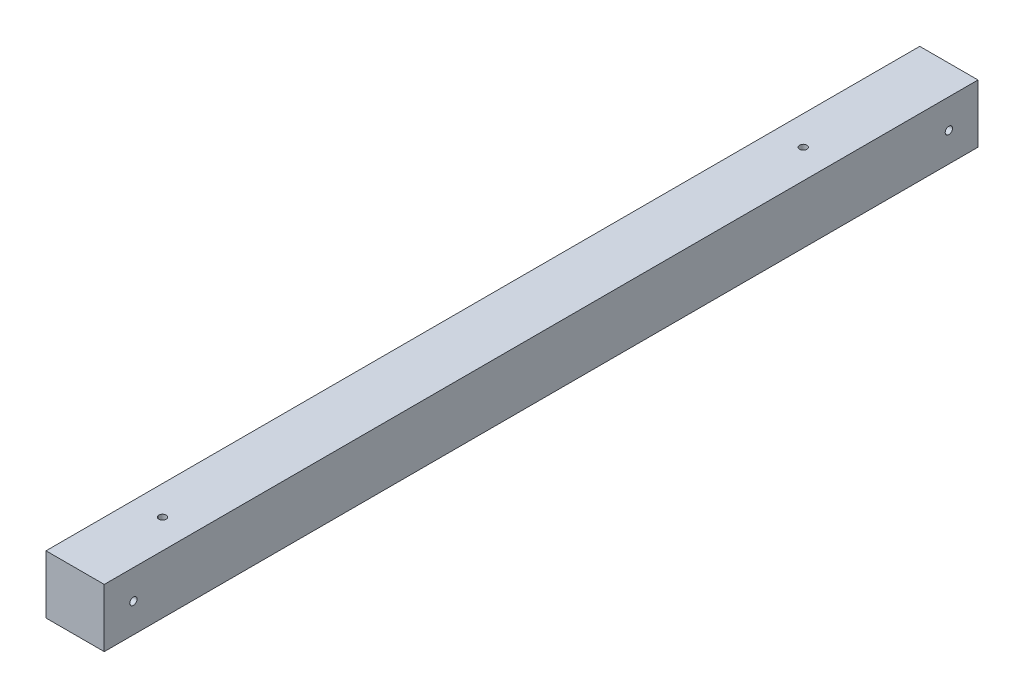
ISO-10303-21;
HEADER;
FILE_DESCRIPTION(('STEP AP214'),'2;1');
FILE_NAME('part.step','',(''),(''),'','','');
FILE_SCHEMA(('AUTOMOTIVE_DESIGN { 1 0 10303 214 1 1 1 1 }'));
ENDSEC;
DATA;
#1=APPLICATION_CONTEXT('core data for automotive mechanical design processes');
#2=APPLICATION_PROTOCOL_DEFINITION('international standard','automotive_design',2000,#1);
#3=PRODUCT_CONTEXT('',#1,'mechanical');
#4=PRODUCT('Part','Part','',(#3));
#5=PRODUCT_RELATED_PRODUCT_CATEGORY('part','',(#4));
#6=PRODUCT_DEFINITION_FORMATION('','',#4);
#7=PRODUCT_DEFINITION_CONTEXT('part definition',#1,'design');
#8=PRODUCT_DEFINITION('design','',#6,#7);
#9=PRODUCT_DEFINITION_SHAPE('','',#8);
#10=(LENGTH_UNIT() NAMED_UNIT(*) SI_UNIT(.MILLI.,.METRE.));
#11=(NAMED_UNIT(*) PLANE_ANGLE_UNIT() SI_UNIT($,.RADIAN.));
#12=(NAMED_UNIT(*) SI_UNIT($,.STERADIAN.) SOLID_ANGLE_UNIT());
#13=UNCERTAINTY_MEASURE_WITH_UNIT(LENGTH_MEASURE(1.E-05),#10,'distance_accuracy_value','');
#14=(GEOMETRIC_REPRESENTATION_CONTEXT(3) GLOBAL_UNCERTAINTY_ASSIGNED_CONTEXT((#13)) GLOBAL_UNIT_ASSIGNED_CONTEXT((#10,
#11,#12)) REPRESENTATION_CONTEXT('',''));
#15=CARTESIAN_POINT('',(0.,0.,0.));
#16=DIRECTION('',(0.,0.,1.));
#17=DIRECTION('',(1.,0.,0.));
#18=AXIS2_PLACEMENT_3D('',#15,#16,#17);
#19=CARTESIAN_POINT('',(-12.7,-12.7,381.));
#20=DIRECTION('',(1.,0.,0.));
#21=DIRECTION('',(0.,0.,-1.));
#22=AXIS2_PLACEMENT_3D('',#19,#20,#21);
#23=PLANE('',#22);
#24=CARTESIAN_POINT('',(-12.7,0.,368.3));
#25=DIRECTION('',(1.,0.,0.));
#26=DIRECTION('',(0.,0.,-1.));
#27=AXIS2_PLACEMENT_3D('',#24,#25,#26);
#28=CIRCLE('',#27,1.5875);
#29=CARTESIAN_POINT('',(-12.7,0.,366.7125));
#30=VERTEX_POINT('',#29);
#31=EDGE_CURVE('E134',#30,#30,#28,.T.);
#32=ORIENTED_EDGE('',*,*,#31,.T.);
#33=EDGE_LOOP('',(#32));
#34=FACE_BOUND('',#33,.T.);
#35=CARTESIAN_POINT('',(-12.7,0.,12.7));
#36=DIRECTION('',(1.,0.,0.));
#37=DIRECTION('',(0.,0.,-1.));
#38=AXIS2_PLACEMENT_3D('',#35,#36,#37);
#39=CIRCLE('',#38,1.5875);
#40=CARTESIAN_POINT('',(-12.7,0.,11.1125));
#41=VERTEX_POINT('',#40);
#42=EDGE_CURVE('E110',#41,#41,#39,.T.);
#43=ORIENTED_EDGE('',*,*,#42,.T.);
#44=EDGE_LOOP('',(#43));
#45=FACE_BOUND('',#44,.T.);
#46=DIRECTION('',(0.,-1.,0.));
#47=VECTOR('',#46,1.);
#48=CARTESIAN_POINT('',(-12.7,-12.7,0.));
#49=LINE('',#48,#47);
#50=CARTESIAN_POINT('',(-12.7,12.7,0.));
#51=VERTEX_POINT('',#50);
#52=CARTESIAN_POINT('',(-12.7,-12.7,0.));
#53=VERTEX_POINT('',#52);
#54=EDGE_CURVE('E106',#51,#53,#49,.T.);
#55=ORIENTED_EDGE('',*,*,#54,.T.);
#56=DIRECTION('',(0.,0.,-1.));
#57=VECTOR('',#56,1.);
#58=CARTESIAN_POINT('',(-12.7,-12.7,381.));
#59=LINE('',#58,#57);
#60=CARTESIAN_POINT('',(-12.7,-12.7,381.));
#61=VERTEX_POINT('',#60);
#62=EDGE_CURVE('E11',#61,#53,#59,.T.);
#63=ORIENTED_EDGE('',*,*,#62,.F.);
#64=DIRECTION('',(0.,-1.,0.));
#65=VECTOR('',#64,1.);
#66=CARTESIAN_POINT('',(-12.7,-12.7,381.));
#67=LINE('',#66,#65);
#68=CARTESIAN_POINT('',(-12.7,12.7,381.));
#69=VERTEX_POINT('',#68);
#70=EDGE_CURVE('E90',#69,#61,#67,.T.);
#71=ORIENTED_EDGE('',*,*,#70,.F.);
#72=DIRECTION('',(0.,0.,-1.));
#73=VECTOR('',#72,1.);
#74=CARTESIAN_POINT('',(-12.7,12.7,381.));
#75=LINE('',#74,#73);
#76=EDGE_CURVE('E102',#69,#51,#75,.T.);
#77=ORIENTED_EDGE('',*,*,#76,.T.);
#78=EDGE_LOOP('',(#55,#63,#71,#77));
#79=FACE_BOUND('',#78,.T.);
#80=ADVANCED_FACE('F38',(#34,#45,#79),#23,.F.);
#81=CARTESIAN_POINT('',(12.7,-12.7,381.));
#82=DIRECTION('',(0.,1.,0.));
#83=DIRECTION('',(-1.,0.,0.));
#84=AXIS2_PLACEMENT_3D('',#81,#82,#83);
#85=PLANE('',#84);
#86=CARTESIAN_POINT('',(0.,-12.7,342.9));
#87=DIRECTION('',(0.,1.,0.));
#88=DIRECTION('',(0.,0.,1.));
#89=AXIS2_PLACEMENT_3D('',#86,#87,#88);
#90=CIRCLE('',#89,1.5875);
#91=CARTESIAN_POINT('',(0.,-12.7,344.4875));
#92=VERTEX_POINT('',#91);
#93=EDGE_CURVE('E150',#92,#92,#90,.T.);
#94=ORIENTED_EDGE('',*,*,#93,.T.);
#95=EDGE_LOOP('',(#94));
#96=FACE_BOUND('',#95,.T.);
#97=CARTESIAN_POINT('',(0.,-12.7,63.5));
#98=DIRECTION('',(0.,1.,0.));
#99=DIRECTION('',(0.,0.,1.));
#100=AXIS2_PLACEMENT_3D('',#97,#98,#99);
#101=CIRCLE('',#100,1.5875);
#102=CARTESIAN_POINT('',(0.,-12.7,65.0875));
#103=VERTEX_POINT('',#102);
#104=EDGE_CURVE('E142',#103,#103,#101,.T.);
#105=ORIENTED_EDGE('',*,*,#104,.T.);
#106=EDGE_LOOP('',(#105));
#107=FACE_BOUND('',#106,.T.);
#108=DIRECTION('',(1.,0.,0.));
#109=VECTOR('',#108,1.);
#110=CARTESIAN_POINT('',(12.7,-12.7,0.));
#111=LINE('',#110,#109);
#112=CARTESIAN_POINT('',(12.7,-12.7,0.));
#113=VERTEX_POINT('',#112);
#114=EDGE_CURVE('E95',#53,#113,#111,.T.);
#115=ORIENTED_EDGE('',*,*,#114,.T.);
#116=DIRECTION('',(0.,0.,-1.));
#117=VECTOR('',#116,1.);
#118=CARTESIAN_POINT('',(12.7,-12.7,381.));
#119=LINE('',#118,#117);
#120=CARTESIAN_POINT('',(12.7,-12.7,381.));
#121=VERTEX_POINT('',#120);
#122=EDGE_CURVE('E47',#121,#113,#119,.T.);
#123=ORIENTED_EDGE('',*,*,#122,.F.);
#124=DIRECTION('',(1.,0.,0.));
#125=VECTOR('',#124,1.);
#126=CARTESIAN_POINT('',(12.7,-12.7,381.));
#127=LINE('',#126,#125);
#128=EDGE_CURVE('E85',#61,#121,#127,.T.);
#129=ORIENTED_EDGE('',*,*,#128,.F.);
#130=ORIENTED_EDGE('',*,*,#62,.T.);
#131=EDGE_LOOP('',(#115,#123,#129,#130));
#132=FACE_BOUND('',#131,.T.);
#133=ADVANCED_FACE('F94',(#96,#107,#132),#85,.F.);
#134=CARTESIAN_POINT('',(12.7,-12.7,381.));
#135=DIRECTION('',(-1.,0.,0.));
#136=DIRECTION('',(0.,0.,1.));
#137=AXIS2_PLACEMENT_3D('',#134,#135,#136);
#138=PLANE('',#137);
#139=CARTESIAN_POINT('',(12.7,0.,368.3));
#140=DIRECTION('',(1.,0.,0.));
#141=DIRECTION('',(0.,0.,-1.));
#142=AXIS2_PLACEMENT_3D('',#139,#140,#141);
#143=CIRCLE('',#142,1.58749999999999);
#144=CARTESIAN_POINT('',(12.7,0.,366.7125));
#145=VERTEX_POINT('',#144);
#146=EDGE_CURVE('E138',#145,#145,#143,.T.);
#147=ORIENTED_EDGE('',*,*,#146,.F.);
#148=EDGE_LOOP('',(#147));
#149=FACE_BOUND('',#148,.T.);
#150=CARTESIAN_POINT('',(12.7,0.,12.7));
#151=DIRECTION('',(1.,0.,0.));
#152=DIRECTION('',(0.,0.,-1.));
#153=AXIS2_PLACEMENT_3D('',#150,#151,#152);
#154=CIRCLE('',#153,1.58749999999999);
#155=CARTESIAN_POINT('',(12.7,0.,11.1125));
#156=VERTEX_POINT('',#155);
#157=EDGE_CURVE('E130',#156,#156,#154,.T.);
#158=ORIENTED_EDGE('',*,*,#157,.F.);
#159=EDGE_LOOP('',(#158));
#160=FACE_BOUND('',#159,.T.);
#161=DIRECTION('',(0.,1.,0.));
#162=VECTOR('',#161,1.);
#163=CARTESIAN_POINT('',(12.7,-12.7,0.));
#164=LINE('',#163,#162);
#165=CARTESIAN_POINT('',(12.7,12.7,0.));
#166=VERTEX_POINT('',#165);
#167=EDGE_CURVE('E72',#113,#166,#164,.T.);
#168=ORIENTED_EDGE('',*,*,#167,.T.);
#169=DIRECTION('',(0.,0.,-1.));
#170=VECTOR('',#169,1.);
#171=CARTESIAN_POINT('',(12.7,12.7,381.));
#172=LINE('',#171,#170);
#173=CARTESIAN_POINT('',(12.7,12.7,381.));
#174=VERTEX_POINT('',#173);
#175=EDGE_CURVE('E97',#174,#166,#172,.T.);
#176=ORIENTED_EDGE('',*,*,#175,.F.);
#177=DIRECTION('',(0.,1.,0.));
#178=VECTOR('',#177,1.);
#179=CARTESIAN_POINT('',(12.7,-12.7,381.));
#180=LINE('',#179,#178);
#181=EDGE_CURVE('E88',#121,#174,#180,.T.);
#182=ORIENTED_EDGE('',*,*,#181,.F.);
#183=ORIENTED_EDGE('',*,*,#122,.T.);
#184=EDGE_LOOP('',(#168,#176,#182,#183));
#185=FACE_BOUND('',#184,.T.);
#186=ADVANCED_FACE('F98',(#149,#160,#185),#138,.F.);
#187=CARTESIAN_POINT('',(12.7,12.7,381.));
#188=DIRECTION('',(0.,-1.,0.));
#189=DIRECTION('',(1.,0.,0.));
#190=AXIS2_PLACEMENT_3D('',#187,#188,#189);
#191=PLANE('',#190);
#192=CARTESIAN_POINT('',(0.,12.7,342.9));
#193=DIRECTION('',(0.,1.,0.));
#194=DIRECTION('',(0.,0.,1.));
#195=AXIS2_PLACEMENT_3D('',#192,#193,#194);
#196=CIRCLE('',#195,1.58749999999999);
#197=CARTESIAN_POINT('',(0.,12.7,344.4875));
#198=VERTEX_POINT('',#197);
#199=EDGE_CURVE('E154',#198,#198,#196,.T.);
#200=ORIENTED_EDGE('',*,*,#199,.F.);
#201=EDGE_LOOP('',(#200));
#202=FACE_BOUND('',#201,.T.);
#203=CARTESIAN_POINT('',(0.,12.7,63.5));
#204=DIRECTION('',(0.,1.,0.));
#205=DIRECTION('',(0.,0.,1.));
#206=AXIS2_PLACEMENT_3D('',#203,#204,#205);
#207=CIRCLE('',#206,1.58749999999999);
#208=CARTESIAN_POINT('',(0.,12.7,65.0875));
#209=VERTEX_POINT('',#208);
#210=EDGE_CURVE('E146',#209,#209,#207,.T.);
#211=ORIENTED_EDGE('',*,*,#210,.F.);
#212=EDGE_LOOP('',(#211));
#213=FACE_BOUND('',#212,.T.);
#214=DIRECTION('',(-1.,0.,0.));
#215=VECTOR('',#214,1.);
#216=CARTESIAN_POINT('',(12.7,12.7,0.));
#217=LINE('',#216,#215);
#218=EDGE_CURVE('E78',#166,#51,#217,.T.);
#219=ORIENTED_EDGE('',*,*,#218,.T.);
#220=ORIENTED_EDGE('',*,*,#76,.F.);
#221=DIRECTION('',(-1.,0.,0.));
#222=VECTOR('',#221,1.);
#223=CARTESIAN_POINT('',(12.7,12.7,381.));
#224=LINE('',#223,#222);
#225=EDGE_CURVE('E55',#174,#69,#224,.T.);
#226=ORIENTED_EDGE('',*,*,#225,.F.);
#227=ORIENTED_EDGE('',*,*,#175,.T.);
#228=EDGE_LOOP('',(#219,#220,#226,#227));
#229=FACE_BOUND('',#228,.T.);
#230=ADVANCED_FACE('F120',(#202,#213,#229),#191,.F.);
#231=CARTESIAN_POINT('',(0.,0.,381.));
#232=DIRECTION('',(0.,0.,1.));
#233=DIRECTION('',(1.,0.,0.));
#234=AXIS2_PLACEMENT_3D('',#231,#232,#233);
#235=PLANE('',#234);
#236=ORIENTED_EDGE('',*,*,#70,.T.);
#237=ORIENTED_EDGE('',*,*,#128,.T.);
#238=ORIENTED_EDGE('',*,*,#181,.T.);
#239=ORIENTED_EDGE('',*,*,#225,.T.);
#240=EDGE_LOOP('',(#236,#237,#238,#239));
#241=FACE_BOUND('',#240,.T.);
#242=ADVANCED_FACE('F86',(#241),#235,.T.);
#243=CARTESIAN_POINT('',(0.,0.,0.));
#244=DIRECTION('',(0.,0.,1.));
#245=DIRECTION('',(1.,0.,0.));
#246=AXIS2_PLACEMENT_3D('',#243,#244,#245);
#247=PLANE('',#246);
#248=ORIENTED_EDGE('',*,*,#54,.F.);
#249=ORIENTED_EDGE('',*,*,#218,.F.);
#250=ORIENTED_EDGE('',*,*,#167,.F.);
#251=ORIENTED_EDGE('',*,*,#114,.F.);
#252=EDGE_LOOP('',(#248,#249,#250,#251));
#253=FACE_BOUND('',#252,.T.);
#254=ADVANCED_FACE('F123',(#253),#247,.F.);
#255=CARTESIAN_POINT('',(12.7,0.,12.7));
#256=DIRECTION('',(1.,0.,0.));
#257=DIRECTION('',(0.,0.,-1.));
#258=AXIS2_PLACEMENT_3D('',#255,#256,#257);
#259=CYLINDRICAL_SURFACE('',#258,1.58749999999999);
#260=ORIENTED_EDGE('',*,*,#42,.F.);
#261=EDGE_LOOP('',(#260));
#262=FACE_BOUND('',#261,.T.);
#263=ORIENTED_EDGE('',*,*,#157,.T.);
#264=EDGE_LOOP('',(#263));
#265=FACE_BOUND('',#264,.T.);
#266=ADVANCED_FACE('F177',(#262,#265),#259,.F.);
#267=CARTESIAN_POINT('',(12.7,0.,368.3));
#268=DIRECTION('',(1.,0.,0.));
#269=DIRECTION('',(0.,0.,-1.));
#270=AXIS2_PLACEMENT_3D('',#267,#268,#269);
#271=CYLINDRICAL_SURFACE('',#270,1.58749999999999);
#272=ORIENTED_EDGE('',*,*,#31,.F.);
#273=EDGE_LOOP('',(#272));
#274=FACE_BOUND('',#273,.T.);
#275=ORIENTED_EDGE('',*,*,#146,.T.);
#276=EDGE_LOOP('',(#275));
#277=FACE_BOUND('',#276,.T.);
#278=ADVANCED_FACE('F168',(#274,#277),#271,.F.);
#279=CARTESIAN_POINT('',(0.,12.7,63.5));
#280=DIRECTION('',(0.,1.,0.));
#281=DIRECTION('',(0.,0.,1.));
#282=AXIS2_PLACEMENT_3D('',#279,#280,#281);
#283=CYLINDRICAL_SURFACE('',#282,1.58749999999999);
#284=ORIENTED_EDGE('',*,*,#104,.F.);
#285=EDGE_LOOP('',(#284));
#286=FACE_BOUND('',#285,.T.);
#287=ORIENTED_EDGE('',*,*,#210,.T.);
#288=EDGE_LOOP('',(#287));
#289=FACE_BOUND('',#288,.T.);
#290=ADVANCED_FACE('F166',(#286,#289),#283,.F.);
#291=CARTESIAN_POINT('',(0.,12.7,342.9));
#292=DIRECTION('',(0.,1.,0.));
#293=DIRECTION('',(0.,0.,1.));
#294=AXIS2_PLACEMENT_3D('',#291,#292,#293);
#295=CYLINDRICAL_SURFACE('',#294,1.58749999999999);
#296=ORIENTED_EDGE('',*,*,#93,.F.);
#297=EDGE_LOOP('',(#296));
#298=FACE_BOUND('',#297,.T.);
#299=ORIENTED_EDGE('',*,*,#199,.T.);
#300=EDGE_LOOP('',(#299));
#301=FACE_BOUND('',#300,.T.);
#302=ADVANCED_FACE('F159',(#298,#301),#295,.F.);
#303=CLOSED_SHELL('',(#80,#133,#186,#230,#242,#254,#266,#278,#290,#302));
#304=MANIFOLD_SOLID_BREP('B2',#303);
#305=ADVANCED_BREP_SHAPE_REPRESENTATION('',(#18,#304),#14);
#306=SHAPE_DEFINITION_REPRESENTATION(#9,#305);
ENDSEC;
END-ISO-10303-21;
